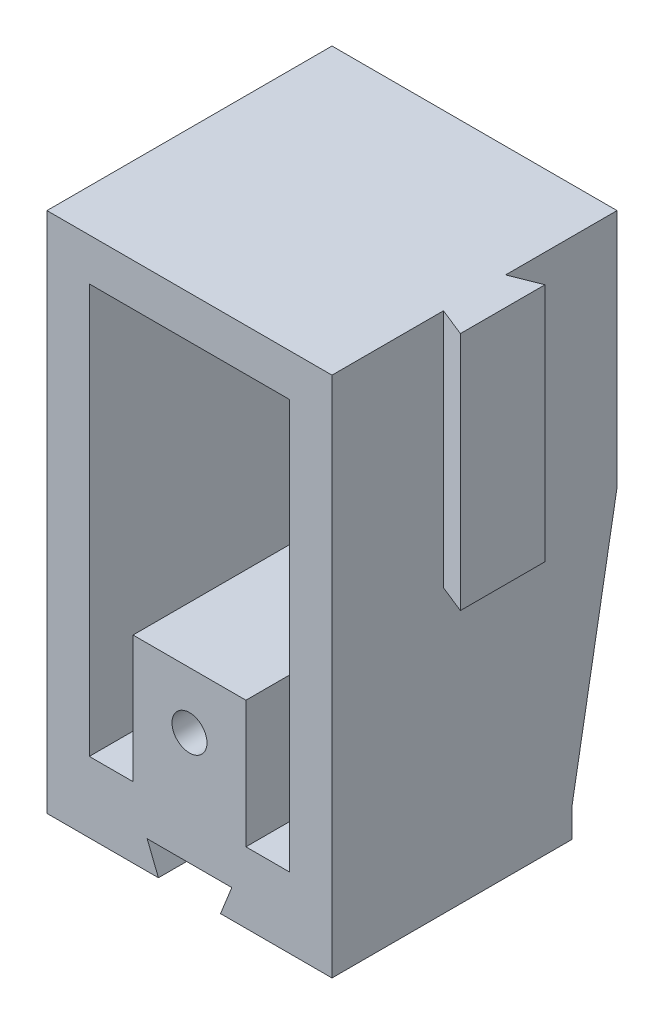
ISO-10303-21;
HEADER;
FILE_DESCRIPTION(('STEP AP214'),'2;1');
FILE_NAME('part.step','',(''),(''),'','','');
FILE_SCHEMA(('AUTOMOTIVE_DESIGN { 1 0 10303 214 1 1 1 1 }'));
ENDSEC;
DATA;
#1=APPLICATION_CONTEXT('core data for automotive mechanical design processes');
#2=APPLICATION_PROTOCOL_DEFINITION('international standard','automotive_design',2000,#1);
#3=PRODUCT_CONTEXT('',#1,'mechanical');
#4=PRODUCT('Part','Part','',(#3));
#5=PRODUCT_RELATED_PRODUCT_CATEGORY('part','',(#4));
#6=PRODUCT_DEFINITION_FORMATION('','',#4);
#7=PRODUCT_DEFINITION_CONTEXT('part definition',#1,'design');
#8=PRODUCT_DEFINITION('design','',#6,#7);
#9=PRODUCT_DEFINITION_SHAPE('','',#8);
#10=(LENGTH_UNIT() NAMED_UNIT(*) SI_UNIT(.MILLI.,.METRE.));
#11=(NAMED_UNIT(*) PLANE_ANGLE_UNIT() SI_UNIT($,.RADIAN.));
#12=(NAMED_UNIT(*) SI_UNIT($,.STERADIAN.) SOLID_ANGLE_UNIT());
#13=UNCERTAINTY_MEASURE_WITH_UNIT(LENGTH_MEASURE(1.E-05),#10,'distance_accuracy_value','');
#14=(GEOMETRIC_REPRESENTATION_CONTEXT(3) GLOBAL_UNCERTAINTY_ASSIGNED_CONTEXT((#13)) GLOBAL_UNIT_ASSIGNED_CONTEXT((#10,
#11,#12)) REPRESENTATION_CONTEXT('',''));
#15=CARTESIAN_POINT('',(0.,0.,0.));
#16=DIRECTION('',(0.,0.,1.));
#17=DIRECTION('',(1.,0.,0.));
#18=AXIS2_PLACEMENT_3D('',#15,#16,#17);
#19=CARTESIAN_POINT('',(0.,42.5,-25.25));
#20=DIRECTION('',(0.,0.,-1.));
#21=DIRECTION('',(-1.,0.,0.));
#22=AXIS2_PLACEMENT_3D('',#19,#20,#21);
#23=PLANE('',#22);
#24=DIRECTION('',(1.,0.,0.));
#25=VECTOR('',#24,1.);
#26=CARTESIAN_POINT('',(-44.75,0.,-25.25));
#27=LINE('',#26,#25);
#28=CARTESIAN_POINT('',(17.75,0.,-25.25));
#29=VERTEX_POINT('',#28);
#30=CARTESIAN_POINT('',(25.25,0.,-25.25));
#31=VERTEX_POINT('',#30);
#32=EDGE_CURVE('E261',#29,#31,#27,.T.);
#33=ORIENTED_EDGE('',*,*,#32,.F.);
#34=DIRECTION('',(0.,1.,0.));
#35=VECTOR('',#34,1.);
#36=CARTESIAN_POINT('',(17.75,42.5,-25.25));
#37=LINE('',#36,#35);
#38=CARTESIAN_POINT('',(17.75,35.,-25.25));
#39=VERTEX_POINT('',#38);
#40=EDGE_CURVE('E242',#29,#39,#37,.T.);
#41=ORIENTED_EDGE('',*,*,#40,.T.);
#42=DIRECTION('',(-1.,0.,0.));
#43=VECTOR('',#42,1.);
#44=CARTESIAN_POINT('',(0.,35.,-25.25));
#45=LINE('',#44,#43);
#46=CARTESIAN_POINT('',(-17.75,35.,-25.25));
#47=VERTEX_POINT('',#46);
#48=EDGE_CURVE('E245',#39,#47,#45,.T.);
#49=ORIENTED_EDGE('',*,*,#48,.T.);
#50=DIRECTION('',(0.,1.,0.));
#51=VECTOR('',#50,1.);
#52=CARTESIAN_POINT('',(-17.75,42.5,-25.25));
#53=LINE('',#52,#51);
#54=CARTESIAN_POINT('',(-17.75,0.,-25.25));
#55=VERTEX_POINT('',#54);
#56=EDGE_CURVE('E200',#55,#47,#53,.T.);
#57=ORIENTED_EDGE('',*,*,#56,.F.);
#58=CARTESIAN_POINT('',(-25.25,0.,-25.25));
#59=VERTEX_POINT('',#58);
#60=EDGE_CURVE('E257',#59,#55,#27,.T.);
#61=ORIENTED_EDGE('',*,*,#60,.F.);
#62=DIRECTION('',(0.,-1.,0.));
#63=VECTOR('',#62,1.);
#64=CARTESIAN_POINT('',(-25.25,42.5,-25.25));
#65=LINE('',#64,#63);
#66=CARTESIAN_POINT('',(-25.25,42.5,-25.25));
#67=VERTEX_POINT('',#66);
#68=EDGE_CURVE('E346',#67,#59,#65,.T.);
#69=ORIENTED_EDGE('',*,*,#68,.F.);
#70=DIRECTION('',(1.,0.,0.));
#71=VECTOR('',#70,1.);
#72=CARTESIAN_POINT('',(0.,42.5,-25.25));
#73=LINE('',#72,#71);
#74=CARTESIAN_POINT('',(25.25,42.5,-25.25));
#75=VERTEX_POINT('',#74);
#76=EDGE_CURVE('E306',#67,#75,#73,.T.);
#77=ORIENTED_EDGE('',*,*,#76,.T.);
#78=DIRECTION('',(0.,-1.,0.));
#79=VECTOR('',#78,1.);
#80=CARTESIAN_POINT('',(25.25,42.5,-25.25));
#81=LINE('',#80,#79);
#82=EDGE_CURVE('E302',#75,#31,#81,.T.);
#83=ORIENTED_EDGE('',*,*,#82,.T.);
#84=EDGE_LOOP('',(#33,#41,#49,#57,#61,#69,#77,#83));
#85=FACE_BOUND('',#84,.T.);
#86=ADVANCED_FACE('F41',(#85),#23,.T.);
#87=CARTESIAN_POINT('',(0.,42.5,25.25));
#88=DIRECTION('',(0.,0.,-1.));
#89=DIRECTION('',(-1.,0.,0.));
#90=AXIS2_PLACEMENT_3D('',#87,#88,#89);
#91=PLANE('',#90);
#92=DIRECTION('',(1.,0.,0.));
#93=VECTOR('',#92,1.);
#94=CARTESIAN_POINT('',(0.,-45.,25.25));
#95=LINE('',#94,#93);
#96=CARTESIAN_POINT('',(-7.5,-45.,25.25));
#97=VERTEX_POINT('',#96);
#98=CARTESIAN_POINT('',(7.5,-45.,25.25));
#99=VERTEX_POINT('',#98);
#100=EDGE_CURVE('E355',#97,#99,#95,.T.);
#101=ORIENTED_EDGE('',*,*,#100,.T.);
#102=DIRECTION('',(-0.371390676354104,-0.92847669088526,0.));
#103=VECTOR('',#102,1.);
#104=CARTESIAN_POINT('',(36.6379310344828,27.8448275862069,25.25));
#105=LINE('',#104,#103);
#106=CARTESIAN_POINT('',(5.50000000000001,-50.,25.25));
#107=VERTEX_POINT('',#106);
#108=EDGE_CURVE('E286',#99,#107,#105,.T.);
#109=ORIENTED_EDGE('',*,*,#108,.T.);
#110=DIRECTION('',(1.,0.,0.));
#111=VECTOR('',#110,1.);
#112=CARTESIAN_POINT('',(0.,-50.,25.25));
#113=LINE('',#112,#111);
#114=CARTESIAN_POINT('',(25.25,-50.,25.25));
#115=VERTEX_POINT('',#114);
#116=EDGE_CURVE('E293',#107,#115,#113,.T.);
#117=ORIENTED_EDGE('',*,*,#116,.T.);
#118=DIRECTION('',(0.,-1.,0.));
#119=VECTOR('',#118,1.);
#120=CARTESIAN_POINT('',(25.25,42.5,25.25));
#121=LINE('',#120,#119);
#122=CARTESIAN_POINT('',(25.25,42.5,25.25));
#123=VERTEX_POINT('',#122);
#124=EDGE_CURVE('E340',#123,#115,#121,.T.);
#125=ORIENTED_EDGE('',*,*,#124,.F.);
#126=DIRECTION('',(1.,0.,0.));
#127=VECTOR('',#126,1.);
#128=CARTESIAN_POINT('',(0.,42.5,25.25));
#129=LINE('',#128,#127);
#130=CARTESIAN_POINT('',(-25.25,42.5,25.25));
#131=VERTEX_POINT('',#130);
#132=EDGE_CURVE('E313',#131,#123,#129,.T.);
#133=ORIENTED_EDGE('',*,*,#132,.F.);
#134=DIRECTION('',(0.,-1.,0.));
#135=VECTOR('',#134,1.);
#136=CARTESIAN_POINT('',(-25.25,42.5,25.25));
#137=LINE('',#136,#135);
#138=CARTESIAN_POINT('',(-25.25,-50.,25.25));
#139=VERTEX_POINT('',#138);
#140=EDGE_CURVE('E343',#131,#139,#137,.T.);
#141=ORIENTED_EDGE('',*,*,#140,.T.);
#142=CARTESIAN_POINT('',(-5.5,-50.,25.25));
#143=VERTEX_POINT('',#142);
#144=EDGE_CURVE('E294',#139,#143,#113,.T.);
#145=ORIENTED_EDGE('',*,*,#144,.T.);
#146=DIRECTION('',(-0.371390676354104,0.92847669088526,0.));
#147=VECTOR('',#146,1.);
#148=CARTESIAN_POINT('',(-36.6379310344828,27.8448275862069,25.25));
#149=LINE('',#148,#147);
#150=EDGE_CURVE('E281',#143,#97,#149,.T.);
#151=ORIENTED_EDGE('',*,*,#150,.T.);
#152=EDGE_LOOP('',(#101,#109,#117,#125,#133,#141,#145,#151));
#153=FACE_BOUND('',#152,.T.);
#154=CARTESIAN_POINT('',(0.,-25.,25.25));
#155=DIRECTION('',(0.,0.,1.));
#156=DIRECTION('',(1.,0.,0.));
#157=AXIS2_PLACEMENT_3D('',#154,#155,#156);
#158=CIRCLE('',#157,3.1);
#159=CARTESIAN_POINT('',(3.10000000000002,-25.,25.25));
#160=VERTEX_POINT('',#159);
#161=EDGE_CURVE('E247',#160,#160,#158,.T.);
#162=ORIENTED_EDGE('',*,*,#161,.F.);
#163=EDGE_LOOP('',(#162));
#164=FACE_BOUND('',#163,.T.);
#165=DIRECTION('',(0.,-1.,0.));
#166=VECTOR('',#165,1.);
#167=CARTESIAN_POINT('',(17.75,0.,25.25));
#168=LINE('',#167,#166);
#169=CARTESIAN_POINT('',(17.75,35.,25.25));
#170=VERTEX_POINT('',#169);
#171=CARTESIAN_POINT('',(17.75,-37.5,25.25));
#172=VERTEX_POINT('',#171);
#173=EDGE_CURVE('E55',#170,#172,#168,.T.);
#174=ORIENTED_EDGE('',*,*,#173,.T.);
#175=DIRECTION('',(-1.,0.,0.));
#176=VECTOR('',#175,1.);
#177=CARTESIAN_POINT('',(0.,-37.5,25.25));
#178=LINE('',#177,#176);
#179=CARTESIAN_POINT('',(10.,-37.5,25.25));
#180=VERTEX_POINT('',#179);
#181=EDGE_CURVE('E226',#172,#180,#178,.T.);
#182=ORIENTED_EDGE('',*,*,#181,.T.);
#183=DIRECTION('',(0.,-1.,0.));
#184=VECTOR('',#183,1.);
#185=CARTESIAN_POINT('',(10.,0.,25.25));
#186=LINE('',#185,#184);
#187=CARTESIAN_POINT('',(10.,-15.,25.25));
#188=VERTEX_POINT('',#187);
#189=EDGE_CURVE('E223',#188,#180,#186,.T.);
#190=ORIENTED_EDGE('',*,*,#189,.F.);
#191=DIRECTION('',(1.,0.,0.));
#192=VECTOR('',#191,1.);
#193=CARTESIAN_POINT('',(0.,-15.,25.25));
#194=LINE('',#193,#192);
#195=CARTESIAN_POINT('',(-9.99999999999998,-15.,25.25));
#196=VERTEX_POINT('',#195);
#197=EDGE_CURVE('E220',#196,#188,#194,.T.);
#198=ORIENTED_EDGE('',*,*,#197,.F.);
#199=DIRECTION('',(0.,-1.,0.));
#200=VECTOR('',#199,1.);
#201=CARTESIAN_POINT('',(-9.99999999999998,0.,25.25));
#202=LINE('',#201,#200);
#203=CARTESIAN_POINT('',(-9.99999999999998,-37.5,25.25));
#204=VERTEX_POINT('',#203);
#205=EDGE_CURVE('E215',#196,#204,#202,.T.);
#206=ORIENTED_EDGE('',*,*,#205,.T.);
#207=DIRECTION('',(1.,0.,0.));
#208=VECTOR('',#207,1.);
#209=CARTESIAN_POINT('',(0.,-37.5,25.25));
#210=LINE('',#209,#208);
#211=CARTESIAN_POINT('',(-17.75,-37.5,25.25));
#212=VERTEX_POINT('',#211);
#213=EDGE_CURVE('E213',#212,#204,#210,.T.);
#214=ORIENTED_EDGE('',*,*,#213,.F.);
#215=DIRECTION('',(0.,-1.,0.));
#216=VECTOR('',#215,1.);
#217=CARTESIAN_POINT('',(-17.75,0.,25.25));
#218=LINE('',#217,#216);
#219=CARTESIAN_POINT('',(-17.75,35.,25.25));
#220=VERTEX_POINT('',#219);
#221=EDGE_CURVE('E197',#220,#212,#218,.T.);
#222=ORIENTED_EDGE('',*,*,#221,.F.);
#223=DIRECTION('',(1.,0.,0.));
#224=VECTOR('',#223,1.);
#225=CARTESIAN_POINT('',(0.,35.,25.25));
#226=LINE('',#225,#224);
#227=EDGE_CURVE('E206',#220,#170,#226,.T.);
#228=ORIENTED_EDGE('',*,*,#227,.T.);
#229=EDGE_LOOP('',(#174,#182,#190,#198,#206,#214,#222,#228));
#230=FACE_BOUND('',#229,.T.);
#231=ADVANCED_FACE('F210',(#153,#164,#230),#91,.F.);
#232=CARTESIAN_POINT('',(-44.75,-45.,-17.25));
#233=DIRECTION('',(0.,0.175033334717495,0.984562507785907));
#234=DIRECTION('',(0.,-0.984562507785907,0.175033334717495));
#235=AXIS2_PLACEMENT_3D('',#232,#233,#234);
#236=PLANE('',#235);
#237=CARTESIAN_POINT('',(0.,-25.,-20.8055555555556));
#238=DIRECTION('',(0.,0.175033334717495,0.984562507785907));
#239=DIRECTION('',(0.,-0.984562507785907,0.175033334717495));
#240=AXIS2_PLACEMENT_3D('',#237,#238,#239);
#241=ELLIPSE('',#240,3.14860658971395,3.1);
#242=CARTESIAN_POINT('',(0.,-28.1,-20.2544444444444));
#243=VERTEX_POINT('',#242);
#244=EDGE_CURVE('E250',#243,#243,#241,.T.);
#245=ORIENTED_EDGE('',*,*,#244,.T.);
#246=EDGE_LOOP('',(#245));
#247=FACE_BOUND('',#246,.T.);
#248=DIRECTION('',(0.,-0.984562507785907,0.175033334717495));
#249=VECTOR('',#248,1.);
#250=CARTESIAN_POINT('',(17.75,-45.,-17.25));
#251=LINE('',#250,#249);
#252=CARTESIAN_POINT('',(17.75,-37.5,-18.5833333333333));
#253=VERTEX_POINT('',#252);
#254=EDGE_CURVE('E11',#29,#253,#251,.T.);
#255=ORIENTED_EDGE('',*,*,#254,.F.);
#256=ORIENTED_EDGE('',*,*,#32,.T.);
#257=DIRECTION('',(0.,-0.984562507785907,0.175033334717495));
#258=VECTOR('',#257,1.);
#259=CARTESIAN_POINT('',(25.25,-45.,-17.25));
#260=LINE('',#259,#258);
#261=CARTESIAN_POINT('',(25.25,-45.,-17.25));
#262=VERTEX_POINT('',#261);
#263=EDGE_CURVE('E251',#31,#262,#260,.T.);
#264=ORIENTED_EDGE('',*,*,#263,.T.);
#265=DIRECTION('',(1.,0.,0.));
#266=VECTOR('',#265,1.);
#267=CARTESIAN_POINT('',(-44.75,-45.,-17.25));
#268=LINE('',#267,#266);
#269=CARTESIAN_POINT('',(7.49999999999999,-45.,-17.25));
#270=VERTEX_POINT('',#269);
#271=EDGE_CURVE('E256',#270,#262,#268,.T.);
#272=ORIENTED_EDGE('',*,*,#271,.F.);
#273=CARTESIAN_POINT('',(-7.5,-45.,-17.25));
#274=VERTEX_POINT('',#273);
#275=EDGE_CURVE('E268',#274,#270,#268,.T.);
#276=ORIENTED_EDGE('',*,*,#275,.F.);
#277=CARTESIAN_POINT('',(-25.25,-45.,-17.25));
#278=VERTEX_POINT('',#277);
#279=EDGE_CURVE('E266',#278,#274,#268,.T.);
#280=ORIENTED_EDGE('',*,*,#279,.F.);
#281=DIRECTION('',(0.,-0.984562507785907,0.175033334717495));
#282=VECTOR('',#281,1.);
#283=CARTESIAN_POINT('',(-25.25,36.8465773097176,-31.8005026328387));
#284=LINE('',#283,#282);
#285=EDGE_CURVE('E274',#59,#278,#284,.T.);
#286=ORIENTED_EDGE('',*,*,#285,.F.);
#287=ORIENTED_EDGE('',*,*,#60,.T.);
#288=DIRECTION('',(0.,-0.984562507785907,0.175033334717495));
#289=VECTOR('',#288,1.);
#290=CARTESIAN_POINT('',(-17.75,-45.,-17.25));
#291=LINE('',#290,#289);
#292=CARTESIAN_POINT('',(-17.75,-37.5,-18.5833333333333));
#293=VERTEX_POINT('',#292);
#294=EDGE_CURVE('E361',#55,#293,#291,.T.);
#295=ORIENTED_EDGE('',*,*,#294,.T.);
#296=DIRECTION('',(1.,0.,0.));
#297=VECTOR('',#296,1.);
#298=CARTESIAN_POINT('',(-44.75,-37.5,-18.5833333333333));
#299=LINE('',#298,#297);
#300=CARTESIAN_POINT('',(-9.99999999999998,-37.5,-18.5833333333333));
#301=VERTEX_POINT('',#300);
#302=EDGE_CURVE('E366',#293,#301,#299,.T.);
#303=ORIENTED_EDGE('',*,*,#302,.T.);
#304=DIRECTION('',(0.,-0.984562507785907,0.175033334717495));
#305=VECTOR('',#304,1.);
#306=CARTESIAN_POINT('',(-9.99999999999998,-45.,-17.25));
#307=LINE('',#306,#305);
#308=CARTESIAN_POINT('',(-9.99999999999998,-15.,-22.5833333333333));
#309=VERTEX_POINT('',#308);
#310=EDGE_CURVE('E369',#309,#301,#307,.T.);
#311=ORIENTED_EDGE('',*,*,#310,.F.);
#312=DIRECTION('',(1.,0.,0.));
#313=VECTOR('',#312,1.);
#314=CARTESIAN_POINT('',(-44.75,-15.,-22.5833333333333));
#315=LINE('',#314,#313);
#316=CARTESIAN_POINT('',(10.,-15.,-22.5833333333333));
#317=VERTEX_POINT('',#316);
#318=EDGE_CURVE('E371',#309,#317,#315,.T.);
#319=ORIENTED_EDGE('',*,*,#318,.T.);
#320=DIRECTION('',(0.,-0.984562507785907,0.175033334717495));
#321=VECTOR('',#320,1.);
#322=CARTESIAN_POINT('',(10.,-45.,-17.25));
#323=LINE('',#322,#321);
#324=CARTESIAN_POINT('',(10.,-37.5,-18.5833333333333));
#325=VERTEX_POINT('',#324);
#326=EDGE_CURVE('E374',#317,#325,#323,.T.);
#327=ORIENTED_EDGE('',*,*,#326,.T.);
#328=DIRECTION('',(-1.,0.,0.));
#329=VECTOR('',#328,1.);
#330=CARTESIAN_POINT('',(-44.75,-37.5,-18.5833333333333));
#331=LINE('',#330,#329);
#332=EDGE_CURVE('E48',#253,#325,#331,.T.);
#333=ORIENTED_EDGE('',*,*,#332,.F.);
#334=EDGE_LOOP('',(#255,#256,#264,#272,#276,#280,#286,#287,#295,#303,#311,#319,#327,#333));
#335=FACE_BOUND('',#334,.T.);
#336=ADVANCED_FACE('F388',(#247,#335),#236,.F.);
#337=CARTESIAN_POINT('',(0.,-50.,0.));
#338=DIRECTION('',(0.,1.,0.));
#339=DIRECTION('',(0.,0.,1.));
#340=AXIS2_PLACEMENT_3D('',#337,#338,#339);
#341=PLANE('',#340);
#342=DIRECTION('',(0.,0.,-1.));
#343=VECTOR('',#342,1.);
#344=CARTESIAN_POINT('',(5.50000000000001,-50.,0.));
#345=LINE('',#344,#343);
#346=CARTESIAN_POINT('',(5.49999999999999,-50.,-17.25));
#347=VERTEX_POINT('',#346);
#348=EDGE_CURVE('E352',#107,#347,#345,.T.);
#349=ORIENTED_EDGE('',*,*,#348,.T.);
#350=DIRECTION('',(1.,0.,0.));
#351=VECTOR('',#350,1.);
#352=CARTESIAN_POINT('',(-44.75,-50.,-17.25));
#353=LINE('',#352,#351);
#354=CARTESIAN_POINT('',(25.25,-50.,-17.25));
#355=VERTEX_POINT('',#354);
#356=EDGE_CURVE('E262',#347,#355,#353,.T.);
#357=ORIENTED_EDGE('',*,*,#356,.T.);
#358=DIRECTION('',(0.,0.,1.));
#359=VECTOR('',#358,1.);
#360=CARTESIAN_POINT('',(25.25,-50.,0.));
#361=LINE('',#360,#359);
#362=EDGE_CURVE('E289',#355,#115,#361,.T.);
#363=ORIENTED_EDGE('',*,*,#362,.T.);
#364=ORIENTED_EDGE('',*,*,#116,.F.);
#365=EDGE_LOOP('',(#349,#357,#363,#364));
#366=FACE_BOUND('',#365,.T.);
#367=ADVANCED_FACE('F438',(#366),#341,.F.);
#368=CARTESIAN_POINT('',(0.,0.,0.));
#369=DIRECTION('',(0.,1.,0.));
#370=DIRECTION('',(0.,0.,1.));
#371=AXIS2_PLACEMENT_3D('',#368,#369,#370);
#372=PLANE('',#371);
#373=DIRECTION('',(0.,0.,1.));
#374=VECTOR('',#373,1.);
#375=CARTESIAN_POINT('',(25.25,0.,0.));
#376=LINE('',#375,#374);
#377=CARTESIAN_POINT('',(25.25,0.,-5.5));
#378=VERTEX_POINT('',#377);
#379=CARTESIAN_POINT('',(25.25,0.,5.49999999999999));
#380=VERTEX_POINT('',#379);
#381=EDGE_CURVE('E298',#378,#380,#376,.T.);
#382=ORIENTED_EDGE('',*,*,#381,.F.);
#383=DIRECTION('',(0.928476690885259,0.,-0.371390676354104));
#384=VECTOR('',#383,1.);
#385=CARTESIAN_POINT('',(1.58620689655172,0.,3.96551724137931));
#386=LINE('',#385,#384);
#387=CARTESIAN_POINT('',(30.25,0.,-7.5));
#388=VERTEX_POINT('',#387);
#389=EDGE_CURVE('E307',#378,#388,#386,.T.);
#390=ORIENTED_EDGE('',*,*,#389,.T.);
#391=DIRECTION('',(0.,0.,1.));
#392=VECTOR('',#391,1.);
#393=CARTESIAN_POINT('',(30.25,0.,0.));
#394=LINE('',#393,#392);
#395=CARTESIAN_POINT('',(30.25,0.,7.5));
#396=VERTEX_POINT('',#395);
#397=EDGE_CURVE('E327',#388,#396,#394,.T.);
#398=ORIENTED_EDGE('',*,*,#397,.T.);
#399=DIRECTION('',(-0.928476690885259,0.,-0.371390676354106));
#400=VECTOR('',#399,1.);
#401=CARTESIAN_POINT('',(1.58620689655176,0.,-3.96551724137938));
#402=LINE('',#401,#400);
#403=EDGE_CURVE('E297',#396,#380,#402,.T.);
#404=ORIENTED_EDGE('',*,*,#403,.T.);
#405=EDGE_LOOP('',(#382,#390,#398,#404));
#406=FACE_BOUND('',#405,.T.);
#407=ADVANCED_FACE('F484',(#406),#372,.F.);
#408=CARTESIAN_POINT('',(-25.25,42.5,0.));
#409=DIRECTION('',(1.,0.,0.));
#410=DIRECTION('',(0.,0.,-1.));
#411=AXIS2_PLACEMENT_3D('',#408,#409,#410);
#412=PLANE('',#411);
#413=ORIENTED_EDGE('',*,*,#68,.T.);
#414=ORIENTED_EDGE('',*,*,#285,.T.);
#415=DIRECTION('',(0.,-1.,0.));
#416=VECTOR('',#415,1.);
#417=CARTESIAN_POINT('',(-25.25,42.5,-17.25));
#418=LINE('',#417,#416);
#419=CARTESIAN_POINT('',(-25.25,-50.,-17.25));
#420=VERTEX_POINT('',#419);
#421=EDGE_CURVE('E271',#278,#420,#418,.T.);
#422=ORIENTED_EDGE('',*,*,#421,.T.);
#423=DIRECTION('',(0.,0.,1.));
#424=VECTOR('',#423,1.);
#425=CARTESIAN_POINT('',(-25.25,-50.,0.));
#426=LINE('',#425,#424);
#427=EDGE_CURVE('E291',#420,#139,#426,.T.);
#428=ORIENTED_EDGE('',*,*,#427,.T.);
#429=ORIENTED_EDGE('',*,*,#140,.F.);
#430=DIRECTION('',(0.,0.,1.));
#431=VECTOR('',#430,1.);
#432=CARTESIAN_POINT('',(-25.25,42.5,0.));
#433=LINE('',#432,#431);
#434=EDGE_CURVE('E311',#67,#131,#433,.T.);
#435=ORIENTED_EDGE('',*,*,#434,.F.);
#436=EDGE_LOOP('',(#413,#414,#422,#428,#429,#435));
#437=FACE_BOUND('',#436,.T.);
#438=ADVANCED_FACE('F423',(#437),#412,.F.);
#439=CARTESIAN_POINT('',(25.25,42.5,0.));
#440=DIRECTION('',(1.,0.,0.));
#441=DIRECTION('',(0.,0.,-1.));
#442=AXIS2_PLACEMENT_3D('',#439,#440,#441);
#443=PLANE('',#442);
#444=ORIENTED_EDGE('',*,*,#263,.F.);
#445=ORIENTED_EDGE('',*,*,#82,.F.);
#446=DIRECTION('',(0.,0.,1.));
#447=VECTOR('',#446,1.);
#448=CARTESIAN_POINT('',(25.25,42.5,0.));
#449=LINE('',#448,#447);
#450=CARTESIAN_POINT('',(25.25,42.5,-5.5));
#451=VERTEX_POINT('',#450);
#452=EDGE_CURVE('E303',#75,#451,#449,.T.);
#453=ORIENTED_EDGE('',*,*,#452,.T.);
#454=DIRECTION('',(0.,-1.,0.));
#455=VECTOR('',#454,1.);
#456=CARTESIAN_POINT('',(25.25,42.5,-5.5));
#457=LINE('',#456,#455);
#458=EDGE_CURVE('E324',#451,#378,#457,.T.);
#459=ORIENTED_EDGE('',*,*,#458,.T.);
#460=ORIENTED_EDGE('',*,*,#381,.T.);
#461=DIRECTION('',(0.,-1.,0.));
#462=VECTOR('',#461,1.);
#463=CARTESIAN_POINT('',(25.25,42.5,5.49999999999999));
#464=LINE('',#463,#462);
#465=CARTESIAN_POINT('',(25.25,42.5,5.49999999999999));
#466=VERTEX_POINT('',#465);
#467=EDGE_CURVE('E338',#466,#380,#464,.T.);
#468=ORIENTED_EDGE('',*,*,#467,.F.);
#469=EDGE_CURVE('E308',#466,#123,#449,.T.);
#470=ORIENTED_EDGE('',*,*,#469,.T.);
#471=ORIENTED_EDGE('',*,*,#124,.T.);
#472=ORIENTED_EDGE('',*,*,#362,.F.);
#473=DIRECTION('',(0.,-1.,0.));
#474=VECTOR('',#473,1.);
#475=CARTESIAN_POINT('',(25.25,-50.,-17.25));
#476=LINE('',#475,#474);
#477=EDGE_CURVE('E254',#262,#355,#476,.T.);
#478=ORIENTED_EDGE('',*,*,#477,.F.);
#479=EDGE_LOOP('',(#444,#445,#453,#459,#460,#468,#470,#471,#472,#478));
#480=FACE_BOUND('',#479,.T.);
#481=ADVANCED_FACE('F442',(#480),#443,.T.);
#482=CARTESIAN_POINT('',(1.58620689655176,42.5,-3.96551724137938));
#483=DIRECTION('',(-0.371390676354106,0.,0.928476690885258));
#484=DIRECTION('',(0.928476690885259,0.,0.371390676354106));
#485=AXIS2_PLACEMENT_3D('',#482,#483,#484);
#486=PLANE('',#485);
#487=ORIENTED_EDGE('',*,*,#403,.F.);
#488=DIRECTION('',(0.,-1.,0.));
#489=VECTOR('',#488,1.);
#490=CARTESIAN_POINT('',(30.25,42.5,7.5));
#491=LINE('',#490,#489);
#492=CARTESIAN_POINT('',(30.25,42.5,7.5));
#493=VERTEX_POINT('',#492);
#494=EDGE_CURVE('E336',#493,#396,#491,.T.);
#495=ORIENTED_EDGE('',*,*,#494,.F.);
#496=DIRECTION('',(-0.928476690885259,0.,-0.371390676354106));
#497=VECTOR('',#496,1.);
#498=CARTESIAN_POINT('',(1.58620689655176,42.5,-3.96551724137938));
#499=LINE('',#498,#497);
#500=EDGE_CURVE('E315',#493,#466,#499,.T.);
#501=ORIENTED_EDGE('',*,*,#500,.T.);
#502=ORIENTED_EDGE('',*,*,#467,.T.);
#503=EDGE_LOOP('',(#487,#495,#501,#502));
#504=FACE_BOUND('',#503,.T.);
#505=ADVANCED_FACE('F452',(#504),#486,.T.);
#506=CARTESIAN_POINT('',(30.25,42.5,0.));
#507=DIRECTION('',(1.,0.,0.));
#508=DIRECTION('',(0.,0.,-1.));
#509=AXIS2_PLACEMENT_3D('',#506,#507,#508);
#510=PLANE('',#509);
#511=ORIENTED_EDGE('',*,*,#397,.F.);
#512=DIRECTION('',(0.,-1.,0.));
#513=VECTOR('',#512,1.);
#514=CARTESIAN_POINT('',(30.25,42.5,-7.5));
#515=LINE('',#514,#513);
#516=CARTESIAN_POINT('',(30.25,42.5,-7.5));
#517=VERTEX_POINT('',#516);
#518=EDGE_CURVE('E334',#517,#388,#515,.T.);
#519=ORIENTED_EDGE('',*,*,#518,.F.);
#520=DIRECTION('',(0.,0.,1.));
#521=VECTOR('',#520,1.);
#522=CARTESIAN_POINT('',(30.25,42.5,0.));
#523=LINE('',#522,#521);
#524=EDGE_CURVE('E318',#517,#493,#523,.T.);
#525=ORIENTED_EDGE('',*,*,#524,.T.);
#526=ORIENTED_EDGE('',*,*,#494,.T.);
#527=EDGE_LOOP('',(#511,#519,#525,#526));
#528=FACE_BOUND('',#527,.T.);
#529=ADVANCED_FACE('F455',(#528),#510,.T.);
#530=CARTESIAN_POINT('',(1.58620689655172,42.5,3.96551724137931));
#531=DIRECTION('',(-0.371390676354104,0.,-0.928476690885259));
#532=DIRECTION('',(-0.928476690885259,0.,0.371390676354104));
#533=AXIS2_PLACEMENT_3D('',#530,#531,#532);
#534=PLANE('',#533);
#535=ORIENTED_EDGE('',*,*,#389,.F.);
#536=ORIENTED_EDGE('',*,*,#458,.F.);
#537=DIRECTION('',(0.928476690885259,0.,-0.371390676354104));
#538=VECTOR('',#537,1.);
#539=CARTESIAN_POINT('',(1.58620689655172,42.5,3.96551724137931));
#540=LINE('',#539,#538);
#541=EDGE_CURVE('E321',#451,#517,#540,.T.);
#542=ORIENTED_EDGE('',*,*,#541,.T.);
#543=ORIENTED_EDGE('',*,*,#518,.T.);
#544=EDGE_LOOP('',(#535,#536,#542,#543));
#545=FACE_BOUND('',#544,.T.);
#546=ADVANCED_FACE('F459',(#545),#534,.T.);
#547=CARTESIAN_POINT('',(0.,42.5,0.));
#548=DIRECTION('',(0.,1.,0.));
#549=DIRECTION('',(0.,0.,1.));
#550=AXIS2_PLACEMENT_3D('',#547,#548,#549);
#551=PLANE('',#550);
#552=ORIENTED_EDGE('',*,*,#452,.F.);
#553=ORIENTED_EDGE('',*,*,#76,.F.);
#554=ORIENTED_EDGE('',*,*,#434,.T.);
#555=ORIENTED_EDGE('',*,*,#132,.T.);
#556=ORIENTED_EDGE('',*,*,#469,.F.);
#557=ORIENTED_EDGE('',*,*,#500,.F.);
#558=ORIENTED_EDGE('',*,*,#524,.F.);
#559=ORIENTED_EDGE('',*,*,#541,.F.);
#560=EDGE_LOOP('',(#552,#553,#554,#555,#556,#557,#558,#559));
#561=FACE_BOUND('',#560,.T.);
#562=ADVANCED_FACE('F448',(#561),#551,.T.);
#563=ORIENTED_EDGE('',*,*,#427,.F.);
#564=CARTESIAN_POINT('',(-5.50000000000001,-50.,-17.25));
#565=VERTEX_POINT('',#564);
#566=EDGE_CURVE('E265',#420,#565,#353,.T.);
#567=ORIENTED_EDGE('',*,*,#566,.T.);
#568=DIRECTION('',(0.,0.,1.));
#569=VECTOR('',#568,1.);
#570=CARTESIAN_POINT('',(-5.5,-50.,0.));
#571=LINE('',#570,#569);
#572=EDGE_CURVE('E301',#565,#143,#571,.T.);
#573=ORIENTED_EDGE('',*,*,#572,.T.);
#574=ORIENTED_EDGE('',*,*,#144,.F.);
#575=EDGE_LOOP('',(#563,#567,#573,#574));
#576=FACE_BOUND('',#575,.T.);
#577=ADVANCED_FACE('F409',(#576),#341,.F.);
#578=CARTESIAN_POINT('',(7.5,-45.,44.75));
#579=DIRECTION('',(0.,1.,0.));
#580=DIRECTION('',(0.,0.,1.));
#581=AXIS2_PLACEMENT_3D('',#578,#579,#580);
#582=PLANE('',#581);
#583=DIRECTION('',(0.,0.,-1.));
#584=VECTOR('',#583,1.);
#585=CARTESIAN_POINT('',(-7.5,-45.,44.75));
#586=LINE('',#585,#584);
#587=EDGE_CURVE('E277',#97,#274,#586,.T.);
#588=ORIENTED_EDGE('',*,*,#587,.T.);
#589=ORIENTED_EDGE('',*,*,#275,.T.);
#590=DIRECTION('',(0.,0.,-1.));
#591=VECTOR('',#590,1.);
#592=CARTESIAN_POINT('',(7.5,-45.,44.75));
#593=LINE('',#592,#591);
#594=EDGE_CURVE('E278',#99,#270,#593,.T.);
#595=ORIENTED_EDGE('',*,*,#594,.F.);
#596=ORIENTED_EDGE('',*,*,#100,.F.);
#597=EDGE_LOOP('',(#588,#589,#595,#596));
#598=FACE_BOUND('',#597,.T.);
#599=ADVANCED_FACE('F432',(#598),#582,.F.);
#600=CARTESIAN_POINT('',(5.50000000000001,-50.,44.75));
#601=DIRECTION('',(0.928476690885259,-0.371390676354104,0.));
#602=DIRECTION('',(0.371390676354104,0.92847669088526,0.));
#603=AXIS2_PLACEMENT_3D('',#600,#601,#602);
#604=PLANE('',#603);
#605=ORIENTED_EDGE('',*,*,#594,.T.);
#606=DIRECTION('',(-0.371390676354104,-0.92847669088526,0.));
#607=VECTOR('',#606,1.);
#608=CARTESIAN_POINT('',(5.5,-50.,-17.25));
#609=LINE('',#608,#607);
#610=EDGE_CURVE('E260',#270,#347,#609,.T.);
#611=ORIENTED_EDGE('',*,*,#610,.T.);
#612=ORIENTED_EDGE('',*,*,#348,.F.);
#613=ORIENTED_EDGE('',*,*,#108,.F.);
#614=EDGE_LOOP('',(#605,#611,#612,#613));
#615=FACE_BOUND('',#614,.T.);
#616=ADVANCED_FACE('F434',(#615),#604,.F.);
#617=CARTESIAN_POINT('',(-7.5,-45.,44.75));
#618=DIRECTION('',(-0.928476690885259,-0.371390676354104,0.));
#619=DIRECTION('',(0.371390676354104,-0.92847669088526,0.));
#620=AXIS2_PLACEMENT_3D('',#617,#618,#619);
#621=PLANE('',#620);
#622=ORIENTED_EDGE('',*,*,#572,.F.);
#623=DIRECTION('',(-0.371390676354104,0.92847669088526,0.));
#624=VECTOR('',#623,1.);
#625=CARTESIAN_POINT('',(-7.5,-45.,-17.25));
#626=LINE('',#625,#624);
#627=EDGE_CURVE('E358',#565,#274,#626,.T.);
#628=ORIENTED_EDGE('',*,*,#627,.T.);
#629=ORIENTED_EDGE('',*,*,#587,.F.);
#630=ORIENTED_EDGE('',*,*,#150,.F.);
#631=EDGE_LOOP('',(#622,#628,#629,#630));
#632=FACE_BOUND('',#631,.T.);
#633=ADVANCED_FACE('F414',(#632),#621,.F.);
#634=CARTESIAN_POINT('',(-44.75,-50.,-17.25));
#635=DIRECTION('',(0.,0.,1.));
#636=DIRECTION('',(1.,0.,0.));
#637=AXIS2_PLACEMENT_3D('',#634,#635,#636);
#638=PLANE('',#637);
#639=ORIENTED_EDGE('',*,*,#279,.T.);
#640=ORIENTED_EDGE('',*,*,#627,.F.);
#641=ORIENTED_EDGE('',*,*,#566,.F.);
#642=ORIENTED_EDGE('',*,*,#421,.F.);
#643=EDGE_LOOP('',(#639,#640,#641,#642));
#644=FACE_BOUND('',#643,.T.);
#645=ADVANCED_FACE('F426',(#644),#638,.F.);
#646=ORIENTED_EDGE('',*,*,#271,.T.);
#647=ORIENTED_EDGE('',*,*,#477,.T.);
#648=ORIENTED_EDGE('',*,*,#356,.F.);
#649=ORIENTED_EDGE('',*,*,#610,.F.);
#650=EDGE_LOOP('',(#646,#647,#648,#649));
#651=FACE_BOUND('',#650,.T.);
#652=ADVANCED_FACE('F461',(#651),#638,.F.);
#653=CARTESIAN_POINT('',(0.,-25.,-44.75));
#654=DIRECTION('',(0.,0.,1.));
#655=DIRECTION('',(1.,0.,0.));
#656=AXIS2_PLACEMENT_3D('',#653,#654,#655);
#657=CYLINDRICAL_SURFACE('',#656,3.1);
#658=ORIENTED_EDGE('',*,*,#161,.T.);
#659=EDGE_LOOP('',(#658));
#660=FACE_BOUND('',#659,.T.);
#661=ORIENTED_EDGE('',*,*,#244,.F.);
#662=EDGE_LOOP('',(#661));
#663=FACE_BOUND('',#662,.T.);
#664=ADVANCED_FACE('F463',(#660,#663),#657,.F.);
#665=CARTESIAN_POINT('',(0.,-37.5,-29.75));
#666=DIRECTION('',(0.,1.,0.));
#667=DIRECTION('',(0.,0.,1.));
#668=AXIS2_PLACEMENT_3D('',#665,#666,#667);
#669=PLANE('',#668);
#670=ORIENTED_EDGE('',*,*,#332,.T.);
#671=DIRECTION('',(0.,0.,1.));
#672=VECTOR('',#671,1.);
#673=CARTESIAN_POINT('',(10.,-37.5,-29.75));
#674=LINE('',#673,#672);
#675=EDGE_CURVE('E231',#325,#180,#674,.T.);
#676=ORIENTED_EDGE('',*,*,#675,.T.);
#677=ORIENTED_EDGE('',*,*,#181,.F.);
#678=DIRECTION('',(0.,0.,1.));
#679=VECTOR('',#678,1.);
#680=CARTESIAN_POINT('',(17.75,-37.5,-29.75));
#681=LINE('',#680,#679);
#682=EDGE_CURVE('E229',#253,#172,#681,.T.);
#683=ORIENTED_EDGE('',*,*,#682,.F.);
#684=EDGE_LOOP('',(#670,#676,#677,#683));
#685=FACE_BOUND('',#684,.T.);
#686=ADVANCED_FACE('F380',(#685),#669,.T.);
#687=CARTESIAN_POINT('',(10.,0.,-29.75));
#688=DIRECTION('',(-1.,0.,0.));
#689=DIRECTION('',(0.,-1.,0.));
#690=AXIS2_PLACEMENT_3D('',#687,#688,#689);
#691=PLANE('',#690);
#692=DIRECTION('',(0.,0.,1.));
#693=VECTOR('',#692,1.);
#694=CARTESIAN_POINT('',(10.,-15.,-29.75));
#695=LINE('',#694,#693);
#696=EDGE_CURVE('E233',#317,#188,#695,.T.);
#697=ORIENTED_EDGE('',*,*,#696,.T.);
#698=ORIENTED_EDGE('',*,*,#189,.T.);
#699=ORIENTED_EDGE('',*,*,#675,.F.);
#700=ORIENTED_EDGE('',*,*,#326,.F.);
#701=EDGE_LOOP('',(#697,#698,#699,#700));
#702=FACE_BOUND('',#701,.T.);
#703=ADVANCED_FACE('F385',(#702),#691,.F.);
#704=CARTESIAN_POINT('',(0.,-15.,-29.75));
#705=DIRECTION('',(0.,-1.,0.));
#706=DIRECTION('',(0.,0.,-1.));
#707=AXIS2_PLACEMENT_3D('',#704,#705,#706);
#708=PLANE('',#707);
#709=DIRECTION('',(0.,0.,1.));
#710=VECTOR('',#709,1.);
#711=CARTESIAN_POINT('',(-9.99999999999998,-15.,-29.75));
#712=LINE('',#711,#710);
#713=EDGE_CURVE('E235',#309,#196,#712,.T.);
#714=ORIENTED_EDGE('',*,*,#713,.T.);
#715=ORIENTED_EDGE('',*,*,#197,.T.);
#716=ORIENTED_EDGE('',*,*,#696,.F.);
#717=ORIENTED_EDGE('',*,*,#318,.F.);
#718=EDGE_LOOP('',(#714,#715,#716,#717));
#719=FACE_BOUND('',#718,.T.);
#720=ADVANCED_FACE('F392',(#719),#708,.F.);
#721=CARTESIAN_POINT('',(-9.99999999999998,0.,-29.75));
#722=DIRECTION('',(-1.,0.,0.));
#723=DIRECTION('',(0.,-1.,0.));
#724=AXIS2_PLACEMENT_3D('',#721,#722,#723);
#725=PLANE('',#724);
#726=ORIENTED_EDGE('',*,*,#310,.T.);
#727=DIRECTION('',(0.,0.,1.));
#728=VECTOR('',#727,1.);
#729=CARTESIAN_POINT('',(-9.99999999999998,-37.5,-29.75));
#730=LINE('',#729,#728);
#731=EDGE_CURVE('E237',#301,#204,#730,.T.);
#732=ORIENTED_EDGE('',*,*,#731,.T.);
#733=ORIENTED_EDGE('',*,*,#205,.F.);
#734=ORIENTED_EDGE('',*,*,#713,.F.);
#735=EDGE_LOOP('',(#726,#732,#733,#734));
#736=FACE_BOUND('',#735,.T.);
#737=ADVANCED_FACE('F395',(#736),#725,.T.);
#738=CARTESIAN_POINT('',(0.,-37.5,-29.75));
#739=DIRECTION('',(0.,-1.,0.));
#740=DIRECTION('',(0.,0.,-1.));
#741=AXIS2_PLACEMENT_3D('',#738,#739,#740);
#742=PLANE('',#741);
#743=DIRECTION('',(0.,0.,1.));
#744=VECTOR('',#743,1.);
#745=CARTESIAN_POINT('',(-17.75,-37.5,-29.75));
#746=LINE('',#745,#744);
#747=EDGE_CURVE('E63',#293,#212,#746,.T.);
#748=ORIENTED_EDGE('',*,*,#747,.T.);
#749=ORIENTED_EDGE('',*,*,#213,.T.);
#750=ORIENTED_EDGE('',*,*,#731,.F.);
#751=ORIENTED_EDGE('',*,*,#302,.F.);
#752=EDGE_LOOP('',(#748,#749,#750,#751));
#753=FACE_BOUND('',#752,.T.);
#754=ADVANCED_FACE('F399',(#753),#742,.F.);
#755=CARTESIAN_POINT('',(17.75,0.,-29.75));
#756=DIRECTION('',(-1.,0.,0.));
#757=DIRECTION('',(0.,-1.,0.));
#758=AXIS2_PLACEMENT_3D('',#755,#756,#757);
#759=PLANE('',#758);
#760=ORIENTED_EDGE('',*,*,#254,.T.);
#761=ORIENTED_EDGE('',*,*,#682,.T.);
#762=ORIENTED_EDGE('',*,*,#173,.F.);
#763=DIRECTION('',(0.,0.,1.));
#764=VECTOR('',#763,1.);
#765=CARTESIAN_POINT('',(17.75,35.,-29.75));
#766=LINE('',#765,#764);
#767=EDGE_CURVE('E203',#39,#170,#766,.T.);
#768=ORIENTED_EDGE('',*,*,#767,.F.);
#769=ORIENTED_EDGE('',*,*,#40,.F.);
#770=EDGE_LOOP('',(#760,#761,#762,#768,#769));
#771=FACE_BOUND('',#770,.T.);
#772=ADVANCED_FACE('F403',(#771),#759,.T.);
#773=CARTESIAN_POINT('',(-17.75,0.,-29.75));
#774=DIRECTION('',(-1.,0.,0.));
#775=DIRECTION('',(0.,-1.,0.));
#776=AXIS2_PLACEMENT_3D('',#773,#774,#775);
#777=PLANE('',#776);
#778=ORIENTED_EDGE('',*,*,#56,.T.);
#779=DIRECTION('',(0.,0.,1.));
#780=VECTOR('',#779,1.);
#781=CARTESIAN_POINT('',(-17.75,35.,-29.75));
#782=LINE('',#781,#780);
#783=EDGE_CURVE('E193',#47,#220,#782,.T.);
#784=ORIENTED_EDGE('',*,*,#783,.T.);
#785=ORIENTED_EDGE('',*,*,#221,.T.);
#786=ORIENTED_EDGE('',*,*,#747,.F.);
#787=ORIENTED_EDGE('',*,*,#294,.F.);
#788=EDGE_LOOP('',(#778,#784,#785,#786,#787));
#789=FACE_BOUND('',#788,.T.);
#790=ADVANCED_FACE('F195',(#789),#777,.F.);
#791=CARTESIAN_POINT('',(0.,35.,-29.75));
#792=DIRECTION('',(0.,-1.,0.));
#793=DIRECTION('',(0.,0.,-1.));
#794=AXIS2_PLACEMENT_3D('',#791,#792,#793);
#795=PLANE('',#794);
#796=ORIENTED_EDGE('',*,*,#767,.T.);
#797=ORIENTED_EDGE('',*,*,#227,.F.);
#798=ORIENTED_EDGE('',*,*,#783,.F.);
#799=ORIENTED_EDGE('',*,*,#48,.F.);
#800=EDGE_LOOP('',(#796,#797,#798,#799));
#801=FACE_BOUND('',#800,.T.);
#802=ADVANCED_FACE('F207',(#801),#795,.T.);
#803=CLOSED_SHELL('',(#86,#231,#336,#367,#407,#438,#481,#505,#529,#546,#562,#577,#599,#616,#633,
#645,#652,#664,#686,#703,#720,#737,#754,#772,#790,#802));
#804=MANIFOLD_SOLID_BREP('B2',#803);
#805=ADVANCED_BREP_SHAPE_REPRESENTATION('',(#18,#804),#14);
#806=SHAPE_DEFINITION_REPRESENTATION(#9,#805);
ENDSEC;
END-ISO-10303-21;
